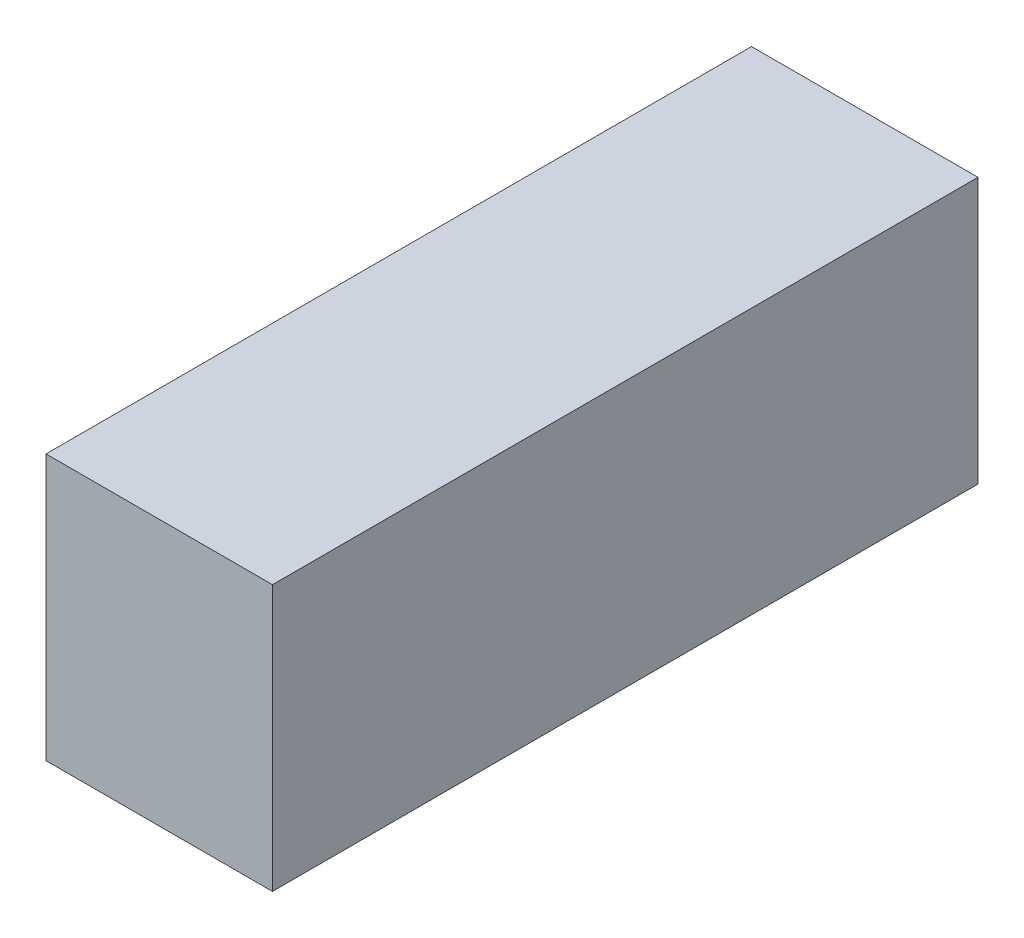
ISO-10303-21;
HEADER;
FILE_DESCRIPTION(('STEP AP214'),'2;1');
FILE_NAME('part.step','',(''),(''),'','','');
FILE_SCHEMA(('AUTOMOTIVE_DESIGN { 1 0 10303 214 1 1 1 1 }'));
ENDSEC;
DATA;
#1=APPLICATION_CONTEXT('core data for automotive mechanical design processes');
#2=APPLICATION_PROTOCOL_DEFINITION('international standard','automotive_design',2000,#1);
#3=PRODUCT_CONTEXT('',#1,'mechanical');
#4=PRODUCT('Part','Part','',(#3));
#5=PRODUCT_RELATED_PRODUCT_CATEGORY('part','',(#4));
#6=PRODUCT_DEFINITION_FORMATION('','',#4);
#7=PRODUCT_DEFINITION_CONTEXT('part definition',#1,'design');
#8=PRODUCT_DEFINITION('design','',#6,#7);
#9=PRODUCT_DEFINITION_SHAPE('','',#8);
#10=(LENGTH_UNIT() NAMED_UNIT(*) SI_UNIT(.MILLI.,.METRE.));
#11=(NAMED_UNIT(*) PLANE_ANGLE_UNIT() SI_UNIT($,.RADIAN.));
#12=(NAMED_UNIT(*) SI_UNIT($,.STERADIAN.) SOLID_ANGLE_UNIT());
#13=UNCERTAINTY_MEASURE_WITH_UNIT(LENGTH_MEASURE(1.E-05),#10,'distance_accuracy_value','');
#14=(GEOMETRIC_REPRESENTATION_CONTEXT(3) GLOBAL_UNCERTAINTY_ASSIGNED_CONTEXT((#13)) GLOBAL_UNIT_ASSIGNED_CONTEXT((#10,
#11,#12)) REPRESENTATION_CONTEXT('',''));
#15=CARTESIAN_POINT('',(0.,0.,0.));
#16=DIRECTION('',(0.,0.,1.));
#17=DIRECTION('',(1.,0.,0.));
#18=AXIS2_PLACEMENT_3D('',#15,#16,#17);
#19=CARTESIAN_POINT('',(26.,30.5,162.));
#20=DIRECTION('',(-1.,0.,0.));
#21=DIRECTION('',(0.,-1.,0.));
#22=AXIS2_PLACEMENT_3D('',#19,#20,#21);
#23=PLANE('',#22);
#24=DIRECTION('',(0.,1.,0.));
#25=VECTOR('',#24,1.);
#26=CARTESIAN_POINT('',(26.,30.5,0.));
#27=LINE('',#26,#25);
#28=CARTESIAN_POINT('',(26.,-30.5,0.));
#29=VERTEX_POINT('',#28);
#30=CARTESIAN_POINT('',(26.,30.5,0.));
#31=VERTEX_POINT('',#30);
#32=EDGE_CURVE('E97',#29,#31,#27,.T.);
#33=ORIENTED_EDGE('',*,*,#32,.T.);
#34=DIRECTION('',(0.,0.,-1.));
#35=VECTOR('',#34,1.);
#36=CARTESIAN_POINT('',(26.,30.5,162.));
#37=LINE('',#36,#35);
#38=CARTESIAN_POINT('',(26.,30.5,162.));
#39=VERTEX_POINT('',#38);
#40=EDGE_CURVE('E11',#39,#31,#37,.T.);
#41=ORIENTED_EDGE('',*,*,#40,.F.);
#42=DIRECTION('',(0.,1.,0.));
#43=VECTOR('',#42,1.);
#44=CARTESIAN_POINT('',(26.,30.5,162.));
#45=LINE('',#44,#43);
#46=CARTESIAN_POINT('',(26.,-30.5,162.));
#47=VERTEX_POINT('',#46);
#48=EDGE_CURVE('E85',#47,#39,#45,.T.);
#49=ORIENTED_EDGE('',*,*,#48,.F.);
#50=DIRECTION('',(0.,0.,-1.));
#51=VECTOR('',#50,1.);
#52=CARTESIAN_POINT('',(26.,-30.5,162.));
#53=LINE('',#52,#51);
#54=EDGE_CURVE('E93',#47,#29,#53,.T.);
#55=ORIENTED_EDGE('',*,*,#54,.T.);
#56=EDGE_LOOP('',(#33,#41,#49,#55));
#57=FACE_BOUND('',#56,.T.);
#58=ADVANCED_FACE('F34',(#57),#23,.F.);
#59=CARTESIAN_POINT('',(-26.,30.5,162.));
#60=DIRECTION('',(0.,-1.,0.));
#61=DIRECTION('',(0.,0.,-1.));
#62=AXIS2_PLACEMENT_3D('',#59,#60,#61);
#63=PLANE('',#62);
#64=DIRECTION('',(-1.,0.,0.));
#65=VECTOR('',#64,1.);
#66=CARTESIAN_POINT('',(-26.,30.5,0.));
#67=LINE('',#66,#65);
#68=CARTESIAN_POINT('',(-26.,30.5,0.));
#69=VERTEX_POINT('',#68);
#70=EDGE_CURVE('E89',#31,#69,#67,.T.);
#71=ORIENTED_EDGE('',*,*,#70,.T.);
#72=DIRECTION('',(0.,0.,-1.));
#73=VECTOR('',#72,1.);
#74=CARTESIAN_POINT('',(-26.,30.5,162.));
#75=LINE('',#74,#73);
#76=CARTESIAN_POINT('',(-26.,30.5,162.));
#77=VERTEX_POINT('',#76);
#78=EDGE_CURVE('E42',#77,#69,#75,.T.);
#79=ORIENTED_EDGE('',*,*,#78,.F.);
#80=DIRECTION('',(-1.,0.,0.));
#81=VECTOR('',#80,1.);
#82=CARTESIAN_POINT('',(-26.,30.5,162.));
#83=LINE('',#82,#81);
#84=EDGE_CURVE('E80',#39,#77,#83,.T.);
#85=ORIENTED_EDGE('',*,*,#84,.F.);
#86=ORIENTED_EDGE('',*,*,#40,.T.);
#87=EDGE_LOOP('',(#71,#79,#85,#86));
#88=FACE_BOUND('',#87,.T.);
#89=ADVANCED_FACE('F88',(#88),#63,.F.);
#90=CARTESIAN_POINT('',(-26.,30.5,162.));
#91=DIRECTION('',(1.,0.,0.));
#92=DIRECTION('',(0.,1.,0.));
#93=AXIS2_PLACEMENT_3D('',#90,#91,#92);
#94=PLANE('',#93);
#95=DIRECTION('',(0.,-1.,0.));
#96=VECTOR('',#95,1.);
#97=CARTESIAN_POINT('',(-26.,30.5,0.));
#98=LINE('',#97,#96);
#99=CARTESIAN_POINT('',(-26.,-30.5,0.));
#100=VERTEX_POINT('',#99);
#101=EDGE_CURVE('E67',#69,#100,#98,.T.);
#102=ORIENTED_EDGE('',*,*,#101,.T.);
#103=DIRECTION('',(0.,0.,-1.));
#104=VECTOR('',#103,1.);
#105=CARTESIAN_POINT('',(-26.,-30.5,162.));
#106=LINE('',#105,#104);
#107=CARTESIAN_POINT('',(-26.,-30.5,162.));
#108=VERTEX_POINT('',#107);
#109=EDGE_CURVE('E90',#108,#100,#106,.T.);
#110=ORIENTED_EDGE('',*,*,#109,.F.);
#111=DIRECTION('',(0.,-1.,0.));
#112=VECTOR('',#111,1.);
#113=CARTESIAN_POINT('',(-26.,30.5,162.));
#114=LINE('',#113,#112);
#115=EDGE_CURVE('E83',#77,#108,#114,.T.);
#116=ORIENTED_EDGE('',*,*,#115,.F.);
#117=ORIENTED_EDGE('',*,*,#78,.T.);
#118=EDGE_LOOP('',(#102,#110,#116,#117));
#119=FACE_BOUND('',#118,.T.);
#120=ADVANCED_FACE('F91',(#119),#94,.F.);
#121=CARTESIAN_POINT('',(-26.,-30.5,162.));
#122=DIRECTION('',(0.,1.,0.));
#123=DIRECTION('',(0.,0.,1.));
#124=AXIS2_PLACEMENT_3D('',#121,#122,#123);
#125=PLANE('',#124);
#126=DIRECTION('',(1.,0.,0.));
#127=VECTOR('',#126,1.);
#128=CARTESIAN_POINT('',(-26.,-30.5,0.));
#129=LINE('',#128,#127);
#130=EDGE_CURVE('E73',#100,#29,#129,.T.);
#131=ORIENTED_EDGE('',*,*,#130,.T.);
#132=ORIENTED_EDGE('',*,*,#54,.F.);
#133=DIRECTION('',(1.,0.,0.));
#134=VECTOR('',#133,1.);
#135=CARTESIAN_POINT('',(-26.,-30.5,162.));
#136=LINE('',#135,#134);
#137=EDGE_CURVE('E50',#108,#47,#136,.T.);
#138=ORIENTED_EDGE('',*,*,#137,.F.);
#139=ORIENTED_EDGE('',*,*,#109,.T.);
#140=EDGE_LOOP('',(#131,#132,#138,#139));
#141=FACE_BOUND('',#140,.T.);
#142=ADVANCED_FACE('F104',(#141),#125,.F.);
#143=CARTESIAN_POINT('',(0.,0.,162.));
#144=DIRECTION('',(0.,0.,1.));
#145=DIRECTION('',(1.,0.,0.));
#146=AXIS2_PLACEMENT_3D('',#143,#144,#145);
#147=PLANE('',#146);
#148=ORIENTED_EDGE('',*,*,#48,.T.);
#149=ORIENTED_EDGE('',*,*,#84,.T.);
#150=ORIENTED_EDGE('',*,*,#115,.T.);
#151=ORIENTED_EDGE('',*,*,#137,.T.);
#152=EDGE_LOOP('',(#148,#149,#150,#151));
#153=FACE_BOUND('',#152,.T.);
#154=ADVANCED_FACE('F81',(#153),#147,.T.);
#155=CARTESIAN_POINT('',(0.,0.,0.));
#156=DIRECTION('',(0.,0.,1.));
#157=DIRECTION('',(1.,0.,0.));
#158=AXIS2_PLACEMENT_3D('',#155,#156,#157);
#159=PLANE('',#158);
#160=ORIENTED_EDGE('',*,*,#32,.F.);
#161=ORIENTED_EDGE('',*,*,#130,.F.);
#162=ORIENTED_EDGE('',*,*,#101,.F.);
#163=ORIENTED_EDGE('',*,*,#70,.F.);
#164=EDGE_LOOP('',(#160,#161,#162,#163));
#165=FACE_BOUND('',#164,.T.);
#166=ADVANCED_FACE('F107',(#165),#159,.F.);
#167=CLOSED_SHELL('',(#58,#89,#120,#142,#154,#166));
#168=MANIFOLD_SOLID_BREP('B2',#167);
#169=ADVANCED_BREP_SHAPE_REPRESENTATION('',(#18,#168),#14);
#170=SHAPE_DEFINITION_REPRESENTATION(#9,#169);
ENDSEC;
END-ISO-10303-21;
